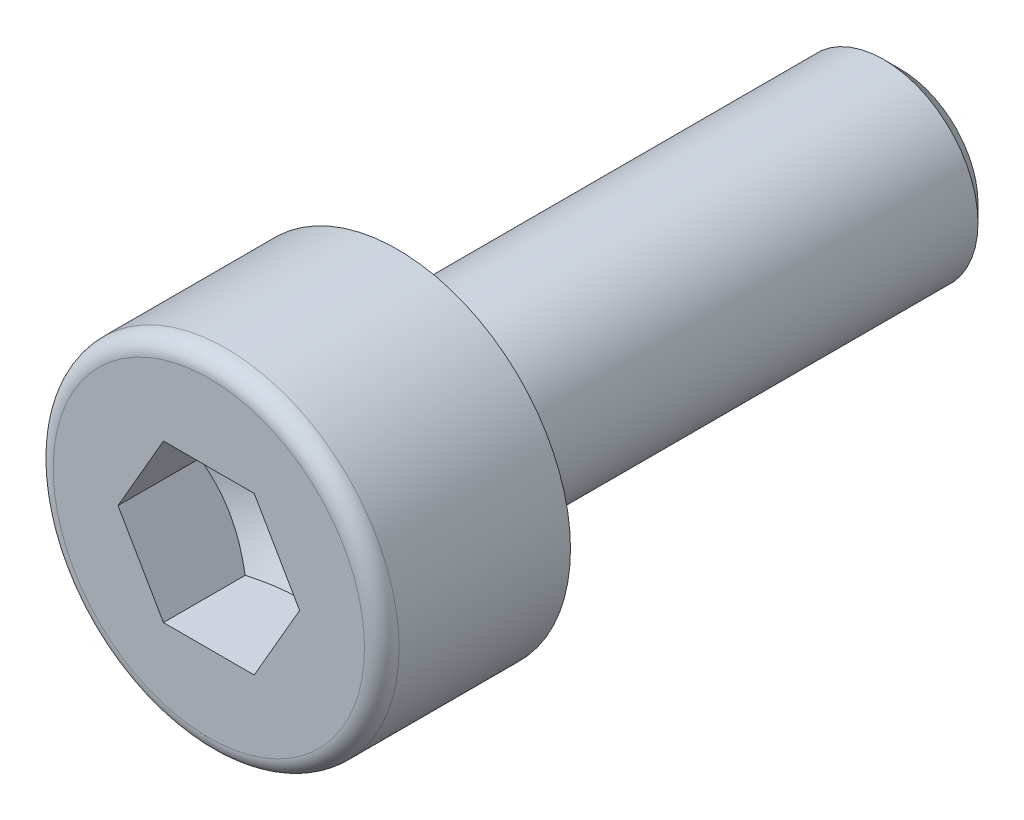
ISO-10303-21;
HEADER;
FILE_DESCRIPTION(('STEP AP214'),'2;1');
FILE_NAME('part.step','',(''),(''),'','','');
FILE_SCHEMA(('AUTOMOTIVE_DESIGN { 1 0 10303 214 1 1 1 1 }'));
ENDSEC;
DATA;
#1=APPLICATION_CONTEXT('core data for automotive mechanical design processes');
#2=APPLICATION_PROTOCOL_DEFINITION('international standard','automotive_design',2000,#1);
#3=PRODUCT_CONTEXT('',#1,'mechanical');
#4=PRODUCT('Part','Part','',(#3));
#5=PRODUCT_RELATED_PRODUCT_CATEGORY('part','',(#4));
#6=PRODUCT_DEFINITION_FORMATION('','',#4);
#7=PRODUCT_DEFINITION_CONTEXT('part definition',#1,'design');
#8=PRODUCT_DEFINITION('design','',#6,#7);
#9=PRODUCT_DEFINITION_SHAPE('','',#8);
#10=(LENGTH_UNIT() NAMED_UNIT(*) SI_UNIT(.MILLI.,.METRE.));
#11=(NAMED_UNIT(*) PLANE_ANGLE_UNIT() SI_UNIT($,.RADIAN.));
#12=(NAMED_UNIT(*) SI_UNIT($,.STERADIAN.) SOLID_ANGLE_UNIT());
#13=UNCERTAINTY_MEASURE_WITH_UNIT(LENGTH_MEASURE(1.E-05),#10,'distance_accuracy_value','');
#14=(GEOMETRIC_REPRESENTATION_CONTEXT(3) GLOBAL_UNCERTAINTY_ASSIGNED_CONTEXT((#13)) GLOBAL_UNIT_ASSIGNED_CONTEXT((#10,
#11,#12)) REPRESENTATION_CONTEXT('',''));
#15=CARTESIAN_POINT('',(0.,0.,0.));
#16=DIRECTION('',(0.,0.,1.));
#17=DIRECTION('',(1.,0.,0.));
#18=AXIS2_PLACEMENT_3D('',#15,#16,#17);
#19=CARTESIAN_POINT('',(0.,0.,3.));
#20=DIRECTION('',(0.,0.,1.));
#21=DIRECTION('',(1.,0.,0.));
#22=AXIS2_PLACEMENT_3D('',#19,#20,#21);
#23=PLANE('',#22);
#24=CARTESIAN_POINT('',(0.,0.,3.));
#25=DIRECTION('',(0.,0.,1.));
#26=DIRECTION('',(1.,0.,0.));
#27=AXIS2_PLACEMENT_3D('',#24,#25,#26);
#28=CIRCLE('',#27,2.475);
#29=CARTESIAN_POINT('',(2.475,0.,3.));
#30=VERTEX_POINT('',#29);
#31=EDGE_CURVE('E117',#30,#30,#28,.T.);
#32=ORIENTED_EDGE('',*,*,#31,.T.);
#33=EDGE_LOOP('',(#32));
#34=FACE_BOUND('',#33,.T.);
#35=DIRECTION('',(1.,0.,0.));
#36=VECTOR('',#35,1.);
#37=CARTESIAN_POINT('',(-0.7216875,1.24999941718736,3.));
#38=LINE('',#37,#36);
#39=CARTESIAN_POINT('',(-0.7216875,1.24999941718736,3.));
#40=VERTEX_POINT('',#39);
#41=CARTESIAN_POINT('',(0.7216875,1.24999941718736,3.));
#42=VERTEX_POINT('',#41);
#43=EDGE_CURVE('E94',#40,#42,#38,.T.);
#44=ORIENTED_EDGE('',*,*,#43,.T.);
#45=DIRECTION('',(0.5,-0.866025403784439,0.));
#46=VECTOR('',#45,1.);
#47=CARTESIAN_POINT('',(0.7216875,1.24999941718736,3.));
#48=LINE('',#47,#46);
#49=CARTESIAN_POINT('',(1.443375,0.,3.));
#50=VERTEX_POINT('',#49);
#51=EDGE_CURVE('E31',#42,#50,#48,.T.);
#52=ORIENTED_EDGE('',*,*,#51,.T.);
#53=DIRECTION('',(-0.5,-0.866025403784439,0.));
#54=VECTOR('',#53,1.);
#55=CARTESIAN_POINT('',(1.443375,0.,3.));
#56=LINE('',#55,#54);
#57=CARTESIAN_POINT('',(0.7216875,-1.24999941718736,3.));
#58=VERTEX_POINT('',#57);
#59=EDGE_CURVE('E393',#50,#58,#56,.T.);
#60=ORIENTED_EDGE('',*,*,#59,.T.);
#61=DIRECTION('',(-1.,0.,0.));
#62=VECTOR('',#61,1.);
#63=CARTESIAN_POINT('',(0.7216875,-1.24999941718736,3.));
#64=LINE('',#63,#62);
#65=CARTESIAN_POINT('',(-0.7216875,-1.24999941718736,3.));
#66=VERTEX_POINT('',#65);
#67=EDGE_CURVE('E397',#58,#66,#64,.T.);
#68=ORIENTED_EDGE('',*,*,#67,.T.);
#69=DIRECTION('',(-0.5,0.866025403784439,0.));
#70=VECTOR('',#69,1.);
#71=CARTESIAN_POINT('',(-0.7216875,-1.24999941718736,3.));
#72=LINE('',#71,#70);
#73=CARTESIAN_POINT('',(-1.443375,0.,3.));
#74=VERTEX_POINT('',#73);
#75=EDGE_CURVE('E402',#66,#74,#72,.T.);
#76=ORIENTED_EDGE('',*,*,#75,.T.);
#77=DIRECTION('',(0.5,0.866025403784439,0.));
#78=VECTOR('',#77,1.);
#79=CARTESIAN_POINT('',(-1.443375,0.,3.));
#80=LINE('',#79,#78);
#81=EDGE_CURVE('E103',#74,#40,#80,.T.);
#82=ORIENTED_EDGE('',*,*,#81,.T.);
#83=EDGE_LOOP('',(#44,#52,#60,#68,#76,#82));
#84=FACE_BOUND('',#83,.T.);
#85=ADVANCED_FACE('F15',(#34,#84),#23,.T.);
#86=CARTESIAN_POINT('',(0.,1.229375,-8.));
#87=DIRECTION('',(0.,0.,-1.));
#88=DIRECTION('',(-1.,0.,0.));
#89=AXIS2_PLACEMENT_3D('',#86,#87,#88);
#90=PLANE('',#89);
#91=CARTESIAN_POINT('',(0.,0.,-8.));
#92=DIRECTION('',(0.,0.,1.));
#93=DIRECTION('',(1.,0.,0.));
#94=AXIS2_PLACEMENT_3D('',#91,#92,#93);
#95=CIRCLE('',#94,1.229375);
#96=CARTESIAN_POINT('',(1.229375,0.,-8.));
#97=VERTEX_POINT('',#96);
#98=EDGE_CURVE('E10',#97,#97,#95,.T.);
#99=ORIENTED_EDGE('',*,*,#98,.F.);
#100=EDGE_LOOP('',(#99));
#101=FACE_BOUND('',#100,.T.);
#102=ADVANCED_FACE('F17',(#101),#90,.T.);
#103=CARTESIAN_POINT('',(0.,0.,-7.729375));
#104=DIRECTION('',(0.,0.,1.));
#105=DIRECTION('',(1.,0.,0.));
#106=AXIS2_PLACEMENT_3D('',#103,#104,#105);
#107=CONICAL_SURFACE('',#106,1.5,0.785398163397445);
#108=ORIENTED_EDGE('',*,*,#98,.T.);
#109=EDGE_LOOP('',(#108));
#110=FACE_BOUND('',#109,.T.);
#111=CARTESIAN_POINT('',(0.,0.,-7.729375));
#112=DIRECTION('',(0.,0.,1.));
#113=DIRECTION('',(1.,0.,0.));
#114=AXIS2_PLACEMENT_3D('',#111,#112,#113);
#115=CIRCLE('',#114,1.5);
#116=CARTESIAN_POINT('',(1.5,0.,-7.729375));
#117=VERTEX_POINT('',#116);
#118=EDGE_CURVE('E24',#117,#117,#115,.T.);
#119=ORIENTED_EDGE('',*,*,#118,.F.);
#120=EDGE_LOOP('',(#119));
#121=FACE_BOUND('',#120,.T.);
#122=ADVANCED_FACE('F158',(#110,#121),#107,.T.);
#123=CARTESIAN_POINT('',(0.,0.,3.));
#124=DIRECTION('',(0.,0.,1.));
#125=DIRECTION('',(1.,0.,0.));
#126=AXIS2_PLACEMENT_3D('',#123,#124,#125);
#127=CYLINDRICAL_SURFACE('',#126,1.5);
#128=ORIENTED_EDGE('',*,*,#118,.T.);
#129=EDGE_LOOP('',(#128));
#130=FACE_BOUND('',#129,.T.);
#131=CARTESIAN_POINT('',(0.,0.,-0.470625));
#132=DIRECTION('',(0.,0.,1.));
#133=DIRECTION('',(1.,0.,0.));
#134=AXIS2_PLACEMENT_3D('',#131,#132,#133);
#135=CIRCLE('',#134,1.5);
#136=CARTESIAN_POINT('',(1.5,0.,-0.470625));
#137=VERTEX_POINT('',#136);
#138=EDGE_CURVE('E145',#137,#137,#135,.T.);
#139=ORIENTED_EDGE('',*,*,#138,.F.);
#140=EDGE_LOOP('',(#139));
#141=FACE_BOUND('',#140,.T.);
#142=ADVANCED_FACE('F155',(#130,#141),#127,.T.);
#143=CARTESIAN_POINT('',(0.,1.229375,-0.470625));
#144=DIRECTION('',(0.,0.,1.));
#145=DIRECTION('',(1.,0.,0.));
#146=AXIS2_PLACEMENT_3D('',#143,#144,#145);
#147=PLANE('',#146);
#148=ORIENTED_EDGE('',*,*,#138,.T.);
#149=EDGE_LOOP('',(#148));
#150=FACE_BOUND('',#149,.T.);
#151=CARTESIAN_POINT('',(0.,0.,-0.470625));
#152=DIRECTION('',(0.,0.,1.));
#153=DIRECTION('',(1.,0.,0.));
#154=AXIS2_PLACEMENT_3D('',#151,#152,#153);
#155=CIRCLE('',#154,1.229375);
#156=CARTESIAN_POINT('',(1.229375,0.,-0.470625));
#157=VERTEX_POINT('',#156);
#158=EDGE_CURVE('E141',#157,#157,#155,.T.);
#159=ORIENTED_EDGE('',*,*,#158,.F.);
#160=EDGE_LOOP('',(#159));
#161=FACE_BOUND('',#160,.T.);
#162=ADVANCED_FACE('F166',(#150,#161),#147,.T.);
#163=CARTESIAN_POINT('',(0.,0.,-0.2));
#164=DIRECTION('',(0.,0.,1.));
#165=DIRECTION('',(1.,0.,0.));
#166=AXIS2_PLACEMENT_3D('',#163,#164,#165);
#167=CONICAL_SURFACE('',#166,1.5,0.785398163397449);
#168=ORIENTED_EDGE('',*,*,#158,.T.);
#169=EDGE_LOOP('',(#168));
#170=FACE_BOUND('',#169,.T.);
#171=CARTESIAN_POINT('',(0.,0.,-0.2));
#172=DIRECTION('',(0.,0.,1.));
#173=DIRECTION('',(1.,0.,0.));
#174=AXIS2_PLACEMENT_3D('',#171,#172,#173);
#175=CIRCLE('',#174,1.5);
#176=CARTESIAN_POINT('',(1.5,0.,-0.2));
#177=VERTEX_POINT('',#176);
#178=EDGE_CURVE('E137',#177,#177,#175,.T.);
#179=ORIENTED_EDGE('',*,*,#178,.F.);
#180=EDGE_LOOP('',(#179));
#181=FACE_BOUND('',#180,.T.);
#182=ADVANCED_FACE('F198',(#170,#181),#167,.T.);
#183=CARTESIAN_POINT('',(0.,0.,3.));
#184=DIRECTION('',(0.,0.,1.));
#185=DIRECTION('',(1.,0.,0.));
#186=AXIS2_PLACEMENT_3D('',#183,#184,#185);
#187=CYLINDRICAL_SURFACE('',#186,1.5);
#188=ORIENTED_EDGE('',*,*,#178,.T.);
#189=EDGE_LOOP('',(#188));
#190=FACE_BOUND('',#189,.T.);
#191=CARTESIAN_POINT('',(0.,0.,-0.15));
#192=DIRECTION('',(0.,0.,1.));
#193=DIRECTION('',(1.,0.,0.));
#194=AXIS2_PLACEMENT_3D('',#191,#192,#193);
#195=CIRCLE('',#194,1.5);
#196=CARTESIAN_POINT('',(1.5,0.,-0.15));
#197=VERTEX_POINT('',#196);
#198=EDGE_CURVE('E133',#197,#197,#195,.T.);
#199=ORIENTED_EDGE('',*,*,#198,.F.);
#200=EDGE_LOOP('',(#199));
#201=FACE_BOUND('',#200,.T.);
#202=ADVANCED_FACE('F194',(#190,#201),#187,.T.);
#203=CARTESIAN_POINT('',(0.,0.,-0.15));
#204=DIRECTION('',(0.,0.,1.));
#205=DIRECTION('',(1.,0.,0.));
#206=AXIS2_PLACEMENT_3D('',#203,#204,#205);
#207=TOROIDAL_SURFACE('',#206,1.65,0.15);
#208=ORIENTED_EDGE('',*,*,#198,.T.);
#209=EDGE_LOOP('',(#208));
#210=FACE_BOUND('',#209,.T.);
#211=CARTESIAN_POINT('',(0.,0.,0.));
#212=DIRECTION('',(0.,0.,1.));
#213=DIRECTION('',(1.,0.,0.));
#214=AXIS2_PLACEMENT_3D('',#211,#212,#213);
#215=CIRCLE('',#214,1.65);
#216=CARTESIAN_POINT('',(1.65,0.,0.));
#217=VERTEX_POINT('',#216);
#218=EDGE_CURVE('E129',#217,#217,#215,.T.);
#219=ORIENTED_EDGE('',*,*,#218,.F.);
#220=EDGE_LOOP('',(#219));
#221=FACE_BOUND('',#220,.T.);
#222=ADVANCED_FACE('F190',(#210,#221),#207,.F.);
#223=CARTESIAN_POINT('',(0.,2.75,0.));
#224=DIRECTION('',(0.,0.,-1.));
#225=DIRECTION('',(-1.,0.,0.));
#226=AXIS2_PLACEMENT_3D('',#223,#224,#225);
#227=PLANE('',#226);
#228=ORIENTED_EDGE('',*,*,#218,.T.);
#229=EDGE_LOOP('',(#228));
#230=FACE_BOUND('',#229,.T.);
#231=CARTESIAN_POINT('',(0.,0.,0.));
#232=DIRECTION('',(0.,0.,1.));
#233=DIRECTION('',(1.,0.,0.));
#234=AXIS2_PLACEMENT_3D('',#231,#232,#233);
#235=CIRCLE('',#234,2.75);
#236=CARTESIAN_POINT('',(2.75,0.,0.));
#237=VERTEX_POINT('',#236);
#238=EDGE_CURVE('E125',#237,#237,#235,.T.);
#239=ORIENTED_EDGE('',*,*,#238,.F.);
#240=EDGE_LOOP('',(#239));
#241=FACE_BOUND('',#240,.T.);
#242=ADVANCED_FACE('F186',(#230,#241),#227,.T.);
#243=CARTESIAN_POINT('',(0.,0.,3.));
#244=DIRECTION('',(0.,0.,1.));
#245=DIRECTION('',(1.,0.,0.));
#246=AXIS2_PLACEMENT_3D('',#243,#244,#245);
#247=CYLINDRICAL_SURFACE('',#246,2.75);
#248=ORIENTED_EDGE('',*,*,#238,.T.);
#249=EDGE_LOOP('',(#248));
#250=FACE_BOUND('',#249,.T.);
#251=CARTESIAN_POINT('',(0.,0.,2.725));
#252=DIRECTION('',(0.,0.,1.));
#253=DIRECTION('',(1.,0.,0.));
#254=AXIS2_PLACEMENT_3D('',#251,#252,#253);
#255=CIRCLE('',#254,2.75);
#256=CARTESIAN_POINT('',(2.75,0.,2.725));
#257=VERTEX_POINT('',#256);
#258=EDGE_CURVE('E121',#257,#257,#255,.T.);
#259=ORIENTED_EDGE('',*,*,#258,.F.);
#260=EDGE_LOOP('',(#259));
#261=FACE_BOUND('',#260,.T.);
#262=ADVANCED_FACE('F182',(#250,#261),#247,.T.);
#263=CARTESIAN_POINT('',(0.,0.,2.725));
#264=DIRECTION('',(0.,0.,1.));
#265=DIRECTION('',(1.,0.,0.));
#266=AXIS2_PLACEMENT_3D('',#263,#264,#265);
#267=TOROIDAL_SURFACE('',#266,2.475,0.275);
#268=ORIENTED_EDGE('',*,*,#31,.F.);
#269=EDGE_LOOP('',(#268));
#270=FACE_BOUND('',#269,.T.);
#271=ORIENTED_EDGE('',*,*,#258,.T.);
#272=EDGE_LOOP('',(#271));
#273=FACE_BOUND('',#272,.T.);
#274=ADVANCED_FACE('F179',(#270,#273),#267,.T.);
#275=CARTESIAN_POINT('',(0.7216875,1.24999941718736,0.866667055208424));
#276=DIRECTION('',(-0.866025403784439,-0.5,0.));
#277=DIRECTION('',(-0.5,0.866025403784439,0.));
#278=AXIS2_PLACEMENT_3D('',#275,#276,#277);
#279=PLANE('',#278);
#280=DIRECTION('',(0.,0.,1.));
#281=VECTOR('',#280,1.);
#282=CARTESIAN_POINT('',(1.443375,0.,0.866667055208424));
#283=LINE('',#282,#281);
#284=CARTESIAN_POINT('',(1.443375,0.,1.7));
#285=VERTEX_POINT('',#284);
#286=EDGE_CURVE('E115',#285,#50,#283,.T.);
#287=ORIENTED_EDGE('',*,*,#286,.T.);
#288=ORIENTED_EDGE('',*,*,#51,.F.);
#289=DIRECTION('',(0.,0.,1.));
#290=VECTOR('',#289,1.);
#291=CARTESIAN_POINT('',(0.7216875,1.24999941718736,0.866667055208424));
#292=LINE('',#291,#290);
#293=CARTESIAN_POINT('',(0.7216875,1.24999941718736,1.7));
#294=VERTEX_POINT('',#293);
#295=EDGE_CURVE('E87',#294,#42,#292,.T.);
#296=ORIENTED_EDGE('',*,*,#295,.F.);
#297=CARTESIAN_POINT('',(1.44337615470054,-2.E-06,1.70000066666746));
#298=CARTESIAN_POINT('',(1.41166234028678,0.0549279378664336,1.68168533615401));
#299=CARTESIAN_POINT('',(1.37967477272109,0.110332030100754,1.665028493242));
#300=CARTESIAN_POINT('',(1.31514579266581,0.222099502117096,1.63595445502155));
#301=CARTESIAN_POINT('',(1.28260323398259,0.278464867164723,1.62354754391631));
#302=CARTESIAN_POINT('',(1.2179214008177,0.39049708853301,1.60423526604097));
#303=CARTESIAN_POINT('',(1.18579207575664,0.446146711951657,1.59720135081684));
#304=CARTESIAN_POINT('',(1.12138232312734,0.557707676008561,1.58880584887112));
#305=CARTESIAN_POINT('',(1.08910212951503,0.613618611423235,1.5874373083282));
#306=CARTESIAN_POINT('',(1.02878989848834,0.718082459879303,1.59029140151107));
#307=CARTESIAN_POINT('',(1.00074881136366,0.766651047478699,1.59381326069777));
#308=CARTESIAN_POINT('',(0.94484931590916,0.863471813723365,1.60497329524828));
#309=CARTESIAN_POINT('',(0.916991100780736,0.91172365773398,1.61261527923588));
#310=CARTESIAN_POINT('',(0.860976444321451,1.00874388868998,1.63171878575366));
#311=CARTESIAN_POINT('',(0.832827088932361,1.0575000024242,1.64326125012845));
#312=CARTESIAN_POINT('',(0.776948107685497,1.15428523701895,1.6694577743606));
#313=CARTESIAN_POINT('',(0.749217766489108,1.20231559688232,1.68410568290989));
#314=CARTESIAN_POINT('',(0.721686345299461,1.25000141718736,1.70000066666746));
#315=B_SPLINE_CURVE_WITH_KNOTS('',3,(#297,#298,#299,#300,#301,#302,#303,#304,#305,#306,#307,
#308,#309,#310,#311,#312,#313,#314),.UNSPECIFIED.,.F.,.F.,(4,2,2,2,2,2,2,2,4),(0.,
0.198135072963001,0.396746271230005,0.590442442133857,0.783900794935013,0.952318546997791,
1.12089225123217,1.29320414395206,1.46517785562982),.UNSPECIFIED.);
#316=EDGE_CURVE('E79',#285,#294,#315,.T.);
#317=ORIENTED_EDGE('',*,*,#316,.F.);
#318=EDGE_LOOP('',(#287,#288,#296,#317));
#319=FACE_BOUND('',#318,.T.);
#320=ADVANCED_FACE('F88',(#319),#279,.T.);
#321=CARTESIAN_POINT('',(1.443375,0.,0.866667055208424));
#322=DIRECTION('',(-0.866025403784439,0.5,0.));
#323=DIRECTION('',(0.5,0.866025403784439,0.));
#324=AXIS2_PLACEMENT_3D('',#321,#322,#323);
#325=PLANE('',#324);
#326=DIRECTION('',(0.,0.,1.));
#327=VECTOR('',#326,1.);
#328=CARTESIAN_POINT('',(0.7216875,-1.24999941718736,0.866667055208424));
#329=LINE('',#328,#327);
#330=CARTESIAN_POINT('',(0.7216875,-1.24999941718736,1.7));
#331=VERTEX_POINT('',#330);
#332=EDGE_CURVE('E112',#331,#58,#329,.T.);
#333=ORIENTED_EDGE('',*,*,#332,.T.);
#334=ORIENTED_EDGE('',*,*,#59,.F.);
#335=ORIENTED_EDGE('',*,*,#286,.F.);
#336=CARTESIAN_POINT('',(0.721686345299462,-1.25000141718736,1.70000066666746));
#337=CARTESIAN_POINT('',(0.753400159713217,-1.19507147932093,1.68168533615401));
#338=CARTESIAN_POINT('',(0.785387727278908,-1.13966738708661,1.665028493242));
#339=CARTESIAN_POINT('',(0.849916707334187,-1.02789991507027,1.63595445502155));
#340=CARTESIAN_POINT('',(0.882459266017406,-0.971534550022641,1.62354754391631));
#341=CARTESIAN_POINT('',(0.947141099182298,-0.859502328654354,1.60423526604097));
#342=CARTESIAN_POINT('',(0.979270424243356,-0.803852705235707,1.59720135081684));
#343=CARTESIAN_POINT('',(1.04368017687266,-0.692291741178803,1.58880584887112));
#344=CARTESIAN_POINT('',(1.07596037048497,-0.63638080576413,1.5874373083282));
#345=CARTESIAN_POINT('',(1.13627260151166,-0.531916957308062,1.59029140151107));
#346=CARTESIAN_POINT('',(1.16431368863634,-0.483348369708666,1.59381326069777));
#347=CARTESIAN_POINT('',(1.22021318409084,-0.386527603463999,1.60497329524828));
#348=CARTESIAN_POINT('',(1.24807139921926,-0.338275759453385,1.61261527923588));
#349=CARTESIAN_POINT('',(1.30408605567855,-0.241255528497386,1.63171878575366));
#350=CARTESIAN_POINT('',(1.33223541106764,-0.192499414763169,1.64326125012845));
#351=CARTESIAN_POINT('',(1.3881143923145,-0.0957141801684128,1.6694577743606));
#352=CARTESIAN_POINT('',(1.41584473351089,-0.0476838203050465,1.68410568290989));
#353=CARTESIAN_POINT('',(1.44337615470054,1.99999999983435E-06,1.70000066666746));
#354=B_SPLINE_CURVE_WITH_KNOTS('',3,(#336,#337,#338,#339,#340,#341,#342,#343,#344,#345,#346,
#347,#348,#349,#350,#351,#352,#353),.UNSPECIFIED.,.F.,.F.,(4,2,2,2,2,2,2,2,4),(0.,
0.198135072963001,0.396746271230005,0.590442442133857,0.783900794935012,0.95231854699779,
1.12089225123217,1.29320414395206,1.46517785562982),.UNSPECIFIED.);
#355=EDGE_CURVE('E83',#331,#285,#354,.T.);
#356=ORIENTED_EDGE('',*,*,#355,.F.);
#357=EDGE_LOOP('',(#333,#334,#335,#356));
#358=FACE_BOUND('',#357,.T.);
#359=ADVANCED_FACE('F255',(#358),#325,.T.);
#360=CARTESIAN_POINT('',(0.7216875,-1.24999941718736,0.866667055208424));
#361=DIRECTION('',(0.,1.,0.));
#362=DIRECTION('',(1.,0.,0.));
#363=AXIS2_PLACEMENT_3D('',#360,#361,#362);
#364=PLANE('',#363);
#365=DIRECTION('',(0.,0.,1.));
#366=VECTOR('',#365,1.);
#367=CARTESIAN_POINT('',(-0.7216875,-1.24999941718736,0.866667055208424));
#368=LINE('',#367,#366);
#369=CARTESIAN_POINT('',(-0.7216875,-1.24999941718736,1.7));
#370=VERTEX_POINT('',#369);
#371=EDGE_CURVE('E109',#370,#66,#368,.T.);
#372=ORIENTED_EDGE('',*,*,#371,.T.);
#373=ORIENTED_EDGE('',*,*,#67,.F.);
#374=ORIENTED_EDGE('',*,*,#332,.F.);
#375=CARTESIAN_POINT('',(-1.86893053107489,-1.24999941718736,2.16479389453662));
#376=CARTESIAN_POINT('',(-1.81495117776836,-1.24999941718736,2.13889663446086));
#377=CARTESIAN_POINT('',(-1.76084043441986,-1.24999941718736,2.11326843017583));
#378=CARTESIAN_POINT('',(-1.65228585942289,-1.24999941718736,2.06270259301794));
#379=CARTESIAN_POINT('',(-1.59784196995446,-1.24999941718736,2.03776508442438));
#380=CARTESIAN_POINT('',(-1.48823862830604,-1.24999941718736,1.98859378412848));
#381=CARTESIAN_POINT('',(-1.43307683885742,-1.24999941718736,1.964365178818));
#382=CARTESIAN_POINT('',(-1.32229127521218,-1.24999941718736,1.91699497239768));
#383=CARTESIAN_POINT('',(-1.26666752521415,-1.24999941718736,1.89385331476833));
#384=CARTESIAN_POINT('',(-1.15340030068293,-1.24999941718736,1.84835454701775));
#385=CARTESIAN_POINT('',(-1.09574203904477,-1.24999941718736,1.82603375946839));
#386=CARTESIAN_POINT('',(-0.979740631963517,-1.24999941718736,1.7832554401815));
#387=CARTESIAN_POINT('',(-0.921397401730977,-1.24999941718736,1.76279814192238));
#388=CARTESIAN_POINT('',(-0.745435180245369,-1.24999941718736,1.7050842361654));
#389=CARTESIAN_POINT('',(-0.626561647576072,-1.24999941718736,1.6713502286798));
#390=CARTESIAN_POINT('',(-0.445872875814715,-1.24999941718736,1.63222043843359));
#391=CARTESIAN_POINT('',(-0.385304520505474,-1.24999941718736,1.62109409740059));
#392=CARTESIAN_POINT('',(-0.263486469039549,-1.24999941718736,1.60342789727153));
#393=CARTESIAN_POINT('',(-0.20223681921018,-1.24999941718736,1.59688772823406));
#394=CARTESIAN_POINT('',(-0.0801324091719259,-1.24999941718736,1.58899883278388));
#395=CARTESIAN_POINT('',(-0.0192817104364654,-1.24999941718736,1.58758884366631));
#396=CARTESIAN_POINT('',(0.102319185361569,-1.24999941718736,1.58991623923036));
#397=CARTESIAN_POINT('',(0.163069375967905,-1.24999941718736,1.59365394263641));
#398=CARTESIAN_POINT('',(0.312961455362286,-1.24999941718736,1.60889807076613));
#399=CARTESIAN_POINT('',(0.40181287263432,-1.24999941718736,1.62326128492051));
#400=CARTESIAN_POINT('',(0.577787885436386,-1.24999941718736,1.66029986996745));
#401=CARTESIAN_POINT('',(0.664909264565296,-1.24999941718736,1.6829852590032));
#402=CARTESIAN_POINT('',(0.795208864990653,-1.24999941718736,1.72173744658089));
#403=CARTESIAN_POINT('',(0.839060620655932,-1.24999941718736,1.73562293145017));
#404=CARTESIAN_POINT('',(0.926307663712636,-1.24999941718736,1.76467838801274));
#405=CARTESIAN_POINT('',(0.969703217226752,-1.24999941718736,1.77984755808705));
#406=CARTESIAN_POINT('',(1.05609584795378,-1.24999941718736,1.81125008410185));
#407=CARTESIAN_POINT('',(1.09909299597128,-1.24999941718736,1.82748324664252));
#408=CARTESIAN_POINT('',(1.18474848915208,-1.24999941718736,1.86083816989018));
#409=CARTESIAN_POINT('',(1.22740677566046,-1.24999941718736,1.87796008072948));
#410=CARTESIAN_POINT('',(1.33629337906013,-1.24999941718736,1.92276108125511));
#411=CARTESIAN_POINT('',(1.40230397627437,-1.24999941718736,1.95096876212353));
#412=CARTESIAN_POINT('',(1.53372907463052,-1.24999941718736,2.00874389121968));
#413=CARTESIAN_POINT('',(1.59914353067598,-1.24999941718736,2.03831144131143));
#414=CARTESIAN_POINT('',(1.79469131828896,-1.24999941718736,2.12857452862346));
#415=CARTESIAN_POINT('',(1.92410722703437,-1.24999941718736,2.19082124932175));
#416=CARTESIAN_POINT('',(2.18183340208154,-1.24999941718736,2.31792530727724));
#417=CARTESIAN_POINT('',(2.31014211360569,-1.24999941718736,2.3827857597699));
#418=CARTESIAN_POINT('',(2.565880437641,-1.24999941718736,2.51417443954414));
#419=CARTESIAN_POINT('',(2.69331015929244,-1.24999941718736,2.58070245483918));
#420=CARTESIAN_POINT('',(2.93556233058972,-1.24999941718736,2.70857379582091));
#421=CARTESIAN_POINT('',(3.05043950275986,-1.24999941718736,2.76981380943349));
#422=CARTESIAN_POINT('',(3.27982431975772,-1.24999941718736,2.89299160700423));
#423=CARTESIAN_POINT('',(3.39433195070739,-1.24999941718736,2.95492941678458));
#424=CARTESIAN_POINT('',(3.62277162051502,-1.24999941718736,3.07916961449806));
#425=CARTESIAN_POINT('',(3.73670438259663,-1.24999941718736,3.14147067442078));
#426=CARTESIAN_POINT('',(3.96433956104116,-1.24999941718736,3.26647828608533));
#427=CARTESIAN_POINT('',(4.07804198914647,-1.24999941718736,3.32918481643642));
#428=CARTESIAN_POINT('',(4.19166166337244,-1.24999941718736,3.39204003381013));
#429=B_SPLINE_CURVE_WITH_KNOTS('',3,(#375,#376,#377,#378,#379,#380,#381,#382,#383,#384,#385,
#386,#387,#388,#389,#390,#391,#392,#393,#394,#395,#396,#397,#398,#399,#400,#401,#402,#403,#404,
#405,#406,#407,#408,#409,#410,#411,#412,#413,#414,#415,#416,#417,#418,#419,#420,#421,#422,#423,
#424,#425,#426,#427,#428),.UNSPECIFIED.,.F.,.F.,(4,2,2,2,2,2,2,2,2,2,2,2,2,2,2,2,2,2,2,2,2,2,2,
2,2,2,4),(0.,0.179612840817485,0.359257792773138,0.539992477393523,0.72071775367729,
0.906167353114828,1.09164015584897,1.46153946542598,1.64614477745769,1.83073761234132,
2.01311873652213,2.1955111535168,2.46497183475509,2.73475795996105,2.87273569413166,
3.01062789275234,3.14849509611698,3.28638566505407,3.50171816734966,3.71706682595868,
4.14783526963883,4.57913326931211,5.01037671616215,5.40091711572386,5.79147201515411,
6.18103353481212,6.57057466801426),.UNSPECIFIED.);
#430=EDGE_CURVE('E439',#370,#331,#429,.T.);
#431=ORIENTED_EDGE('',*,*,#430,.F.);
#432=EDGE_LOOP('',(#372,#373,#374,#431));
#433=FACE_BOUND('',#432,.T.);
#434=ADVANCED_FACE('F261',(#433),#364,.T.);
#435=CARTESIAN_POINT('',(-0.7216875,-1.24999941718736,0.866667055208424));
#436=DIRECTION('',(0.866025403784439,0.5,0.));
#437=DIRECTION('',(0.5,-0.866025403784439,0.));
#438=AXIS2_PLACEMENT_3D('',#435,#436,#437);
#439=PLANE('',#438);
#440=DIRECTION('',(0.,0.,1.));
#441=VECTOR('',#440,1.);
#442=CARTESIAN_POINT('',(-1.443375,0.,0.866667055208424));
#443=LINE('',#442,#441);
#444=CARTESIAN_POINT('',(-1.443375,0.,1.7));
#445=VERTEX_POINT('',#444);
#446=EDGE_CURVE('E100',#445,#74,#443,.T.);
#447=ORIENTED_EDGE('',*,*,#446,.T.);
#448=ORIENTED_EDGE('',*,*,#75,.F.);
#449=ORIENTED_EDGE('',*,*,#371,.F.);
#450=CARTESIAN_POINT('',(-1.44337615470054,2.00000000041633E-06,1.70000066666746));
#451=CARTESIAN_POINT('',(-1.41166234028678,-0.0549279378664328,1.68168533615401));
#452=CARTESIAN_POINT('',(-1.37967477272109,-0.110332030100753,1.665028493242));
#453=CARTESIAN_POINT('',(-1.31514579266581,-0.222099502117095,1.63595445502155));
#454=CARTESIAN_POINT('',(-1.28260323398259,-0.278464867164722,1.62354754391631));
#455=CARTESIAN_POINT('',(-1.2179214008177,-0.390497088533009,1.60423526604097));
#456=CARTESIAN_POINT('',(-1.18579207575664,-0.446146711951656,1.59720135081684));
#457=CARTESIAN_POINT('',(-1.12138232312734,-0.55770767600856,1.58880584887112));
#458=CARTESIAN_POINT('',(-1.08910212951503,-0.613618611423234,1.5874373083282));
#459=CARTESIAN_POINT('',(-1.02878989848834,-0.718082459879302,1.59029140151107));
#460=CARTESIAN_POINT('',(-1.00074881136366,-0.766651047478698,1.59381326069777));
#461=CARTESIAN_POINT('',(-0.944849315909161,-0.863471813723365,1.60497329524827));
#462=CARTESIAN_POINT('',(-0.916991100780737,-0.911723657733979,1.61261527923588));
#463=CARTESIAN_POINT('',(-0.860976444321451,-1.00874388868998,1.63171878575366));
#464=CARTESIAN_POINT('',(-0.832827088932361,-1.0575000024242,1.64326125012845));
#465=CARTESIAN_POINT('',(-0.776948107685497,-1.15428523701895,1.6694577743606));
#466=CARTESIAN_POINT('',(-0.749217766489108,-1.20231559688232,1.68410568290989));
#467=CARTESIAN_POINT('',(-0.721686345299461,-1.25000141718736,1.70000066666746));
#468=B_SPLINE_CURVE_WITH_KNOTS('',3,(#450,#451,#452,#453,#454,#455,#456,#457,#458,#459,#460,
#461,#462,#463,#464,#465,#466,#467),.UNSPECIFIED.,.F.,.F.,(4,2,2,2,2,2,2,2,4),(0.,
0.198135072963001,0.396746271230005,0.590442442133858,0.783900794935013,0.952318546997791,
1.12089225123217,1.29320414395206,1.46517785562982),.UNSPECIFIED.);
#469=EDGE_CURVE('E435',#445,#370,#468,.T.);
#470=ORIENTED_EDGE('',*,*,#469,.F.);
#471=EDGE_LOOP('',(#447,#448,#449,#470));
#472=FACE_BOUND('',#471,.T.);
#473=ADVANCED_FACE('F268',(#472),#439,.T.);
#474=CARTESIAN_POINT('',(-1.443375,0.,0.866667055208424));
#475=DIRECTION('',(0.866025403784439,-0.5,0.));
#476=DIRECTION('',(-0.5,-0.866025403784439,0.));
#477=AXIS2_PLACEMENT_3D('',#474,#475,#476);
#478=PLANE('',#477);
#479=DIRECTION('',(0.,0.,1.));
#480=VECTOR('',#479,1.);
#481=CARTESIAN_POINT('',(-0.7216875,1.24999941718736,0.866667055208424));
#482=LINE('',#481,#480);
#483=CARTESIAN_POINT('',(-0.7216875,1.24999941718736,1.7));
#484=VERTEX_POINT('',#483);
#485=EDGE_CURVE('E93',#484,#40,#482,.T.);
#486=ORIENTED_EDGE('',*,*,#485,.T.);
#487=ORIENTED_EDGE('',*,*,#81,.F.);
#488=ORIENTED_EDGE('',*,*,#446,.F.);
#489=CARTESIAN_POINT('',(-0.721686345299462,1.25000141718736,1.70000066666746));
#490=CARTESIAN_POINT('',(-0.753400159713217,1.19507147932093,1.68168533615401));
#491=CARTESIAN_POINT('',(-0.785387727278908,1.13966738708661,1.665028493242));
#492=CARTESIAN_POINT('',(-0.849916707334187,1.02789991507027,1.63595445502155));
#493=CARTESIAN_POINT('',(-0.882459266017407,0.971534550022641,1.62354754391631));
#494=CARTESIAN_POINT('',(-0.947141099182298,0.859502328654354,1.60423526604097));
#495=CARTESIAN_POINT('',(-0.979270424243356,0.803852705235707,1.59720135081684));
#496=CARTESIAN_POINT('',(-1.04368017687266,0.692291741178803,1.58880584887112));
#497=CARTESIAN_POINT('',(-1.07596037048497,0.636380805764129,1.5874373083282));
#498=CARTESIAN_POINT('',(-1.13627260151166,0.531916957308061,1.59029140151107));
#499=CARTESIAN_POINT('',(-1.16431368863634,0.483348369708665,1.59381326069777));
#500=CARTESIAN_POINT('',(-1.22021318409084,0.386527603463999,1.60497329524828));
#501=CARTESIAN_POINT('',(-1.24807139921926,0.338275759453385,1.61261527923588));
#502=CARTESIAN_POINT('',(-1.30408605567855,0.241255528497386,1.63171878575366));
#503=CARTESIAN_POINT('',(-1.33223541106764,0.192499414763169,1.64326125012845));
#504=CARTESIAN_POINT('',(-1.3881143923145,0.0957141801684129,1.6694577743606));
#505=CARTESIAN_POINT('',(-1.41584473351089,0.0476838203050468,1.68410568290989));
#506=CARTESIAN_POINT('',(-1.44337615470054,-1.99999999947233E-06,1.70000066666746));
#507=B_SPLINE_CURVE_WITH_KNOTS('',3,(#489,#490,#491,#492,#493,#494,#495,#496,#497,#498,#499,
#500,#501,#502,#503,#504,#505,#506),.UNSPECIFIED.,.F.,.F.,(4,2,2,2,2,2,2,2,4),(0.,
0.198135072963001,0.396746271230005,0.590442442133857,0.783900794935013,0.95231854699779,
1.12089225123217,1.29320414395206,1.46517785562982),.UNSPECIFIED.);
#508=EDGE_CURVE('E39',#484,#445,#507,.T.);
#509=ORIENTED_EDGE('',*,*,#508,.F.);
#510=EDGE_LOOP('',(#486,#487,#488,#509));
#511=FACE_BOUND('',#510,.T.);
#512=ADVANCED_FACE('F276',(#511),#478,.T.);
#513=CARTESIAN_POINT('',(-0.7216875,1.24999941718736,0.866667055208424));
#514=DIRECTION('',(0.,-1.,0.));
#515=DIRECTION('',(-1.,0.,0.));
#516=AXIS2_PLACEMENT_3D('',#513,#514,#515);
#517=PLANE('',#516);
#518=ORIENTED_EDGE('',*,*,#295,.T.);
#519=ORIENTED_EDGE('',*,*,#43,.F.);
#520=ORIENTED_EDGE('',*,*,#485,.F.);
#521=CARTESIAN_POINT('',(-1.86893053107489,1.24999941718736,2.16479389453662));
#522=CARTESIAN_POINT('',(-1.81495117776836,1.24999941718736,2.13889663446086));
#523=CARTESIAN_POINT('',(-1.76084043441986,1.24999941718736,2.11326843017583));
#524=CARTESIAN_POINT('',(-1.65228585942289,1.24999941718736,2.06270259301794));
#525=CARTESIAN_POINT('',(-1.59784196995446,1.24999941718736,2.03776508442438));
#526=CARTESIAN_POINT('',(-1.48823862830604,1.24999941718736,1.98859378412848));
#527=CARTESIAN_POINT('',(-1.43307683885742,1.24999941718736,1.964365178818));
#528=CARTESIAN_POINT('',(-1.32229127521218,1.24999941718736,1.91699497239768));
#529=CARTESIAN_POINT('',(-1.26666752521415,1.24999941718736,1.89385331476833));
#530=CARTESIAN_POINT('',(-1.15340030068293,1.24999941718736,1.84835454701775));
#531=CARTESIAN_POINT('',(-1.09574203904477,1.24999941718736,1.82603375946839));
#532=CARTESIAN_POINT('',(-0.979740631963517,1.24999941718736,1.7832554401815));
#533=CARTESIAN_POINT('',(-0.921397401730978,1.24999941718736,1.76279814192238));
#534=CARTESIAN_POINT('',(-0.745435180245369,1.24999941718736,1.7050842361654));
#535=CARTESIAN_POINT('',(-0.626561647576072,1.24999941718736,1.6713502286798));
#536=CARTESIAN_POINT('',(-0.445872875814715,1.24999941718736,1.63222043843359));
#537=CARTESIAN_POINT('',(-0.385304520505474,1.24999941718736,1.62109409740059));
#538=CARTESIAN_POINT('',(-0.263486469039549,1.24999941718736,1.60342789727153));
#539=CARTESIAN_POINT('',(-0.20223681921018,1.24999941718736,1.59688772823406));
#540=CARTESIAN_POINT('',(-0.0801324091719265,1.24999941718736,1.58899883278388));
#541=CARTESIAN_POINT('',(-0.0192817104364659,1.24999941718736,1.58758884366631));
#542=CARTESIAN_POINT('',(0.102319185361568,1.24999941718736,1.58991623923036));
#543=CARTESIAN_POINT('',(0.163069375967905,1.24999941718736,1.59365394263641));
#544=CARTESIAN_POINT('',(0.312961455362285,1.24999941718736,1.60889807076613));
#545=CARTESIAN_POINT('',(0.401812872634319,1.24999941718736,1.62326128492051));
#546=CARTESIAN_POINT('',(0.577787885436385,1.24999941718736,1.66029986996745));
#547=CARTESIAN_POINT('',(0.664909264565295,1.24999941718736,1.6829852590032));
#548=CARTESIAN_POINT('',(0.795208864990651,1.24999941718736,1.72173744658089));
#549=CARTESIAN_POINT('',(0.839060620655931,1.24999941718736,1.73562293145017));
#550=CARTESIAN_POINT('',(0.926307663712634,1.24999941718736,1.76467838801274));
#551=CARTESIAN_POINT('',(0.969703217226751,1.24999941718736,1.77984755808705));
#552=CARTESIAN_POINT('',(1.05609584795378,1.24999941718737,1.81125008410185));
#553=CARTESIAN_POINT('',(1.09909299597128,1.24999941718737,1.82748324664252));
#554=CARTESIAN_POINT('',(1.18474848915208,1.24999941718736,1.86083816989018));
#555=CARTESIAN_POINT('',(1.22740677566045,1.24999941718736,1.87796008072948));
#556=CARTESIAN_POINT('',(1.33629337906013,1.24999941718736,1.92276108125511));
#557=CARTESIAN_POINT('',(1.40230397627436,1.24999941718736,1.95096876212353));
#558=CARTESIAN_POINT('',(1.53372907463051,1.24999941718737,2.00874389121968));
#559=CARTESIAN_POINT('',(1.59914353067597,1.24999941718737,2.03831144131143));
#560=CARTESIAN_POINT('',(1.79469131828895,1.24999941718736,2.12857452862346));
#561=CARTESIAN_POINT('',(1.92410722703437,1.24999941718737,2.19082124932175));
#562=CARTESIAN_POINT('',(2.18183340208154,1.24999941718737,2.31792530727724));
#563=CARTESIAN_POINT('',(2.31014211360569,1.24999941718737,2.3827857597699));
#564=CARTESIAN_POINT('',(2.565880437641,1.24999941718737,2.51417443954414));
#565=CARTESIAN_POINT('',(2.69331015929244,1.24999941718737,2.58070245483918));
#566=CARTESIAN_POINT('',(2.93556233058972,1.24999941718737,2.70857379582091));
#567=CARTESIAN_POINT('',(3.05043950275985,1.24999941718737,2.76981380943349));
#568=CARTESIAN_POINT('',(3.27982431975771,1.24999941718737,2.89299160700422));
#569=CARTESIAN_POINT('',(3.39433195070738,1.24999941718737,2.95492941678457));
#570=CARTESIAN_POINT('',(3.62277162051502,1.24999941718737,3.07916961449806));
#571=CARTESIAN_POINT('',(3.73670438259662,1.24999941718737,3.14147067442078));
#572=CARTESIAN_POINT('',(3.96433956104115,1.24999941718737,3.26647828608533));
#573=CARTESIAN_POINT('',(4.07804198914646,1.24999941718737,3.32918481643642));
#574=CARTESIAN_POINT('',(4.19166166337243,1.24999941718737,3.39204003381013));
#575=B_SPLINE_CURVE_WITH_KNOTS('',3,(#521,#522,#523,#524,#525,#526,#527,#528,#529,#530,#531,
#532,#533,#534,#535,#536,#537,#538,#539,#540,#541,#542,#543,#544,#545,#546,#547,#548,#549,#550,
#551,#552,#553,#554,#555,#556,#557,#558,#559,#560,#561,#562,#563,#564,#565,#566,#567,#568,#569,
#570,#571,#572,#573,#574),.UNSPECIFIED.,.F.,.F.,(4,2,2,2,2,2,2,2,2,2,2,2,2,2,2,2,2,2,2,2,2,2,2,
2,2,2,4),(0.,0.179612840817484,0.359257792773138,0.539992477393523,0.72071775367729,
0.906167353114828,1.09164015584897,1.46153946542598,1.64614477745769,1.83073761234132,
2.01311873652213,2.1955111535168,2.46497183475509,2.73475795996105,2.87273569413165,
3.01062789275234,3.14849509611698,3.28638566505407,3.50171816734966,3.71706682595868,
4.14783526963883,4.5791332693121,5.01037671616214,5.40091711572385,5.7914720151541,
6.18103353481212,6.57057466801426),.UNSPECIFIED.);
#576=EDGE_CURVE('E80',#294,#484,#575,.F.);
#577=ORIENTED_EDGE('',*,*,#576,.F.);
#578=EDGE_LOOP('',(#518,#519,#520,#577));
#579=FACE_BOUND('',#578,.T.);
#580=ADVANCED_FACE('F75',(#579),#517,.T.);
#581=CARTESIAN_POINT('',(0.,0.,0.866667055208424));
#582=DIRECTION('',(0.,0.,1.));
#583=DIRECTION('',(1.,0.,0.));
#584=AXIS2_PLACEMENT_3D('',#581,#582,#583);
#585=CONICAL_SURFACE('',#584,0.,1.0471975511966);
#586=CARTESIAN_POINT('',(0.,0.,0.866667055208424));
#587=VERTEX_POINT('',#586);
#588=VERTEX_LOOP('',#587);
#589=FACE_BOUND('',#588,.T.);
#590=ORIENTED_EDGE('',*,*,#316,.T.);
#591=ORIENTED_EDGE('',*,*,#576,.T.);
#592=ORIENTED_EDGE('',*,*,#508,.T.);
#593=ORIENTED_EDGE('',*,*,#469,.T.);
#594=ORIENTED_EDGE('',*,*,#430,.T.);
#595=ORIENTED_EDGE('',*,*,#355,.T.);
#596=EDGE_LOOP('',(#590,#591,#592,#593,#594,#595));
#597=FACE_BOUND('',#596,.T.);
#598=ADVANCED_FACE('F72',(#589,#597),#585,.F.);
#599=CLOSED_SHELL('',(#85,#102,#122,#142,#162,#182,#202,#222,#242,#262,#274,#320,#359,#434,#473,
#512,#580,#598));
#600=MANIFOLD_SOLID_BREP('B1',#599);
#601=ADVANCED_BREP_SHAPE_REPRESENTATION('',(#18,#600),#14);
#602=SHAPE_DEFINITION_REPRESENTATION(#9,#601);
ENDSEC;
END-ISO-10303-21;
